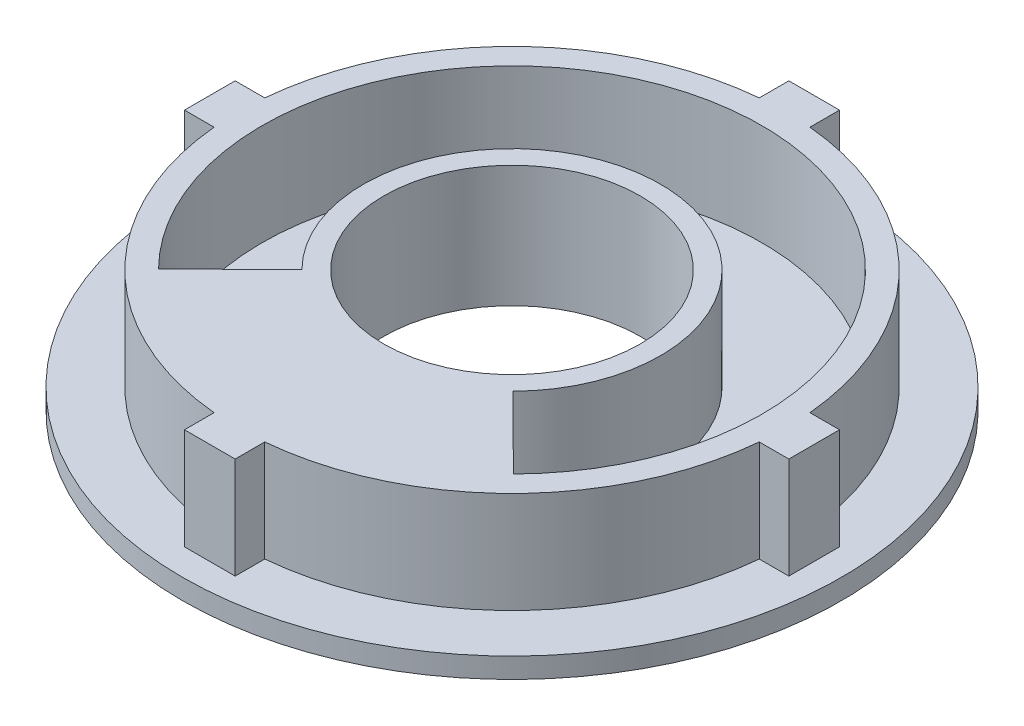
ISO-10303-21;
HEADER;
FILE_DESCRIPTION(('STEP AP214'),'2;1');
FILE_NAME('part.step','',(''),(''),'','','');
FILE_SCHEMA(('AUTOMOTIVE_DESIGN { 1 0 10303 214 1 1 1 1 }'));
ENDSEC;
DATA;
#1=APPLICATION_CONTEXT('core data for automotive mechanical design processes');
#2=APPLICATION_PROTOCOL_DEFINITION('international standard','automotive_design',2000,#1);
#3=PRODUCT_CONTEXT('',#1,'mechanical');
#4=PRODUCT('Part','Part','',(#3));
#5=PRODUCT_RELATED_PRODUCT_CATEGORY('part','',(#4));
#6=PRODUCT_DEFINITION_FORMATION('','',#4);
#7=PRODUCT_DEFINITION_CONTEXT('part definition',#1,'design');
#8=PRODUCT_DEFINITION('design','',#6,#7);
#9=PRODUCT_DEFINITION_SHAPE('','',#8);
#10=(LENGTH_UNIT() NAMED_UNIT(*) SI_UNIT(.MILLI.,.METRE.));
#11=(NAMED_UNIT(*) PLANE_ANGLE_UNIT() SI_UNIT($,.RADIAN.));
#12=(NAMED_UNIT(*) SI_UNIT($,.STERADIAN.) SOLID_ANGLE_UNIT());
#13=UNCERTAINTY_MEASURE_WITH_UNIT(LENGTH_MEASURE(1.E-05),#10,'distance_accuracy_value','');
#14=(GEOMETRIC_REPRESENTATION_CONTEXT(3) GLOBAL_UNCERTAINTY_ASSIGNED_CONTEXT((#13)) GLOBAL_UNIT_ASSIGNED_CONTEXT((#10,
#11,#12)) REPRESENTATION_CONTEXT('',''));
#15=CARTESIAN_POINT('',(0.,0.,0.));
#16=DIRECTION('',(0.,0.,1.));
#17=DIRECTION('',(1.,0.,0.));
#18=AXIS2_PLACEMENT_3D('',#15,#16,#17);
#19=CARTESIAN_POINT('',(0.,10.,0.));
#20=DIRECTION('',(0.,-1.,0.));
#21=DIRECTION('',(0.,0.,-1.));
#22=AXIS2_PLACEMENT_3D('',#19,#20,#21);
#23=CYLINDRICAL_SURFACE('',#22,27.);
#24=DIRECTION('',(0.,-1.,0.));
#25=VECTOR('',#24,1.);
#26=CARTESIAN_POINT('',(-26.8840101175404,10.,-2.49999999999735));
#27=LINE('',#26,#25);
#28=CARTESIAN_POINT('',(-26.8840101175404,10.,-2.49999999999735));
#29=VERTEX_POINT('',#28);
#30=CARTESIAN_POINT('',(-26.8840101175404,0.,-2.49999999999735));
#31=VERTEX_POINT('',#30);
#32=EDGE_CURVE('E204',#29,#31,#27,.T.);
#33=ORIENTED_EDGE('',*,*,#32,.F.);
#34=CARTESIAN_POINT('',(0.,10.,0.));
#35=DIRECTION('',(0.,1.,0.));
#36=DIRECTION('',(0.,0.,1.));
#37=AXIS2_PLACEMENT_3D('',#34,#35,#36);
#38=CIRCLE('',#37,27.);
#39=CARTESIAN_POINT('',(-2.5,10.,-26.8840101175401));
#40=VERTEX_POINT('',#39);
#41=EDGE_CURVE('E44',#40,#29,#38,.T.);
#42=ORIENTED_EDGE('',*,*,#41,.F.);
#43=DIRECTION('',(0.,-1.,0.));
#44=VECTOR('',#43,1.);
#45=CARTESIAN_POINT('',(-2.5,10.,-26.8840101175401));
#46=LINE('',#45,#44);
#47=CARTESIAN_POINT('',(-2.5,0.,-26.8840101175401));
#48=VERTEX_POINT('',#47);
#49=EDGE_CURVE('E280',#48,#40,#46,.F.);
#50=ORIENTED_EDGE('',*,*,#49,.F.);
#51=CARTESIAN_POINT('',(0.,0.,0.));
#52=DIRECTION('',(0.,1.,0.));
#53=DIRECTION('',(0.,0.,1.));
#54=AXIS2_PLACEMENT_3D('',#51,#52,#53);
#55=CIRCLE('',#54,27.);
#56=EDGE_CURVE('E311',#48,#31,#55,.T.);
#57=ORIENTED_EDGE('',*,*,#56,.T.);
#58=EDGE_LOOP('',(#33,#42,#50,#57));
#59=FACE_BOUND('',#58,.T.);
#60=ADVANCED_FACE('F37',(#59),#23,.T.);
#61=DIRECTION('',(0.,-1.,0.));
#62=VECTOR('',#61,1.);
#63=CARTESIAN_POINT('',(-26.8840101175399,10.,2.50000000000265));
#64=LINE('',#63,#62);
#65=CARTESIAN_POINT('',(-26.8840101175399,0.,2.50000000000265));
#66=VERTEX_POINT('',#65);
#67=CARTESIAN_POINT('',(-26.8840101175399,10.,2.50000000000265));
#68=VERTEX_POINT('',#67);
#69=EDGE_CURVE('E188',#66,#68,#64,.F.);
#70=ORIENTED_EDGE('',*,*,#69,.F.);
#71=CARTESIAN_POINT('',(-2.49999999999417,0.,26.8840101175407));
#72=VERTEX_POINT('',#71);
#73=EDGE_CURVE('E333',#66,#72,#55,.T.);
#74=ORIENTED_EDGE('',*,*,#73,.T.);
#75=DIRECTION('',(0.,-1.,0.));
#76=VECTOR('',#75,1.);
#77=CARTESIAN_POINT('',(-2.49999999999417,10.,26.8840101175407));
#78=LINE('',#77,#76);
#79=CARTESIAN_POINT('',(-2.49999999999417,10.,26.8840101175407));
#80=VERTEX_POINT('',#79);
#81=EDGE_CURVE('E231',#80,#72,#78,.T.);
#82=ORIENTED_EDGE('',*,*,#81,.F.);
#83=EDGE_CURVE('E331',#68,#80,#38,.T.);
#84=ORIENTED_EDGE('',*,*,#83,.F.);
#85=EDGE_LOOP('',(#70,#74,#82,#84));
#86=FACE_BOUND('',#85,.T.);
#87=ADVANCED_FACE('F369',(#86),#23,.T.);
#88=CARTESIAN_POINT('',(0.,0.,0.));
#89=DIRECTION('',(0.,-1.,0.));
#90=DIRECTION('',(0.,0.,-1.));
#91=AXIS2_PLACEMENT_3D('',#88,#89,#90);
#92=PLANE('',#91);
#93=CARTESIAN_POINT('',(0.,0.,0.));
#94=DIRECTION('',(0.,-1.,0.));
#95=DIRECTION('',(0.,0.,-1.));
#96=AXIS2_PLACEMENT_3D('',#93,#94,#95);
#97=CIRCLE('',#96,32.5);
#98=CARTESIAN_POINT('',(0.,0.,-32.5));
#99=VERTEX_POINT('',#98);
#100=EDGE_CURVE('E289',#99,#99,#97,.T.);
#101=ORIENTED_EDGE('',*,*,#100,.F.);
#102=EDGE_LOOP('',(#101));
#103=FACE_BOUND('',#102,.T.);
#104=DIRECTION('',(-1.,0.,0.));
#105=VECTOR('',#104,1.);
#106=CARTESIAN_POINT('',(-29.7999999999968,0.,-2.49999999999735));
#107=LINE('',#106,#105);
#108=CARTESIAN_POINT('',(-29.7999999999968,0.,-2.49999999999735));
#109=VERTEX_POINT('',#108);
#110=EDGE_CURVE('E186',#31,#109,#107,.T.);
#111=ORIENTED_EDGE('',*,*,#110,.F.);
#112=ORIENTED_EDGE('',*,*,#56,.F.);
#113=DIRECTION('',(0.,0.,1.));
#114=VECTOR('',#113,1.);
#115=CARTESIAN_POINT('',(-2.5,0.,-29.8));
#116=LINE('',#115,#114);
#117=CARTESIAN_POINT('',(-2.5,0.,-29.8));
#118=VERTEX_POINT('',#117);
#119=EDGE_CURVE('E266',#118,#48,#116,.T.);
#120=ORIENTED_EDGE('',*,*,#119,.F.);
#121=DIRECTION('',(-1.,0.,0.));
#122=VECTOR('',#121,1.);
#123=CARTESIAN_POINT('',(-2.5,0.,-29.8));
#124=LINE('',#123,#122);
#125=CARTESIAN_POINT('',(2.5,0.,-29.8));
#126=VERTEX_POINT('',#125);
#127=EDGE_CURVE('E262',#126,#118,#124,.T.);
#128=ORIENTED_EDGE('',*,*,#127,.F.);
#129=DIRECTION('',(0.,0.,-1.));
#130=VECTOR('',#129,1.);
#131=CARTESIAN_POINT('',(2.5,0.,0.));
#132=LINE('',#131,#130);
#133=CARTESIAN_POINT('',(2.5,0.,-26.8840101175401));
#134=VERTEX_POINT('',#133);
#135=EDGE_CURVE('E11',#134,#126,#132,.T.);
#136=ORIENTED_EDGE('',*,*,#135,.F.);
#137=CARTESIAN_POINT('',(26.8840101175398,0.,-2.50000000000318));
#138=VERTEX_POINT('',#137);
#139=EDGE_CURVE('E293',#138,#134,#55,.T.);
#140=ORIENTED_EDGE('',*,*,#139,.F.);
#141=DIRECTION('',(-1.,0.,0.));
#142=VECTOR('',#141,1.);
#143=CARTESIAN_POINT('',(29.8000000000026,0.,-2.50000000000318));
#144=LINE('',#143,#142);
#145=CARTESIAN_POINT('',(29.8000000000026,0.,-2.50000000000318));
#146=VERTEX_POINT('',#145);
#147=EDGE_CURVE('E238',#146,#138,#144,.T.);
#148=ORIENTED_EDGE('',*,*,#147,.F.);
#149=DIRECTION('',(0.,0.,-1.));
#150=VECTOR('',#149,1.);
#151=CARTESIAN_POINT('',(29.8000000000026,0.,-2.50000000000318));
#152=LINE('',#151,#150);
#153=CARTESIAN_POINT('',(29.8000000000026,0.,2.49999999999682));
#154=VERTEX_POINT('',#153);
#155=EDGE_CURVE('E246',#154,#146,#152,.T.);
#156=ORIENTED_EDGE('',*,*,#155,.F.);
#157=DIRECTION('',(1.,0.,0.));
#158=VECTOR('',#157,1.);
#159=CARTESIAN_POINT('',(29.8000000000026,0.,2.49999999999682));
#160=LINE('',#159,#158);
#161=CARTESIAN_POINT('',(26.8840101175404,0.,2.49999999999682));
#162=VERTEX_POINT('',#161);
#163=EDGE_CURVE('E234',#162,#154,#160,.T.);
#164=ORIENTED_EDGE('',*,*,#163,.F.);
#165=CARTESIAN_POINT('',(2.50000000000583,0.,26.8840101175396));
#166=VERTEX_POINT('',#165);
#167=EDGE_CURVE('E336',#166,#162,#55,.T.);
#168=ORIENTED_EDGE('',*,*,#167,.F.);
#169=DIRECTION('',(0.,0.,-1.));
#170=VECTOR('',#169,1.);
#171=CARTESIAN_POINT('',(2.50000000000583,0.,29.7999999999995));
#172=LINE('',#171,#170);
#173=CARTESIAN_POINT('',(2.50000000000583,0.,29.7999999999995));
#174=VERTEX_POINT('',#173);
#175=EDGE_CURVE('E210',#174,#166,#172,.T.);
#176=ORIENTED_EDGE('',*,*,#175,.F.);
#177=DIRECTION('',(1.,0.,0.));
#178=VECTOR('',#177,1.);
#179=CARTESIAN_POINT('',(2.50000000000583,0.,29.7999999999995));
#180=LINE('',#179,#178);
#181=CARTESIAN_POINT('',(-2.49999999999417,0.,29.7999999999995));
#182=VERTEX_POINT('',#181);
#183=EDGE_CURVE('E218',#182,#174,#180,.T.);
#184=ORIENTED_EDGE('',*,*,#183,.F.);
#185=DIRECTION('',(0.,0.,1.));
#186=VECTOR('',#185,1.);
#187=CARTESIAN_POINT('',(-2.49999999999417,0.,29.7999999999995));
#188=LINE('',#187,#186);
#189=EDGE_CURVE('E206',#72,#182,#188,.T.);
#190=ORIENTED_EDGE('',*,*,#189,.F.);
#191=ORIENTED_EDGE('',*,*,#73,.F.);
#192=DIRECTION('',(1.,0.,0.));
#193=VECTOR('',#192,1.);
#194=CARTESIAN_POINT('',(-29.7999999999968,0.,2.50000000000265));
#195=LINE('',#194,#193);
#196=CARTESIAN_POINT('',(-29.7999999999968,0.,2.50000000000265));
#197=VERTEX_POINT('',#196);
#198=EDGE_CURVE('E56',#197,#66,#195,.T.);
#199=ORIENTED_EDGE('',*,*,#198,.F.);
#200=DIRECTION('',(0.,0.,1.));
#201=VECTOR('',#200,1.);
#202=CARTESIAN_POINT('',(-29.7999999999968,0.,2.50000000000265));
#203=LINE('',#202,#201);
#204=EDGE_CURVE('E51',#109,#197,#203,.T.);
#205=ORIENTED_EDGE('',*,*,#204,.F.);
#206=EDGE_LOOP('',(#111,#112,#120,#128,#136,#140,#148,#156,#164,#168,#176,#184,#190,#191,#199,#205));
#207=FACE_BOUND('',#206,.T.);
#208=ADVANCED_FACE('F347',(#103,#207),#92,.F.);
#209=DIRECTION('',(0.,-1.,0.));
#210=VECTOR('',#209,1.);
#211=CARTESIAN_POINT('',(2.50000000000583,10.,26.8840101175396));
#212=LINE('',#211,#210);
#213=CARTESIAN_POINT('',(2.50000000000583,10.,26.8840101175396));
#214=VERTEX_POINT('',#213);
#215=EDGE_CURVE('E228',#166,#214,#212,.F.);
#216=ORIENTED_EDGE('',*,*,#215,.F.);
#217=ORIENTED_EDGE('',*,*,#167,.T.);
#218=DIRECTION('',(0.,-1.,0.));
#219=VECTOR('',#218,1.);
#220=CARTESIAN_POINT('',(26.8840101175404,10.,2.49999999999682));
#221=LINE('',#220,#219);
#222=CARTESIAN_POINT('',(26.8840101175404,10.,2.49999999999682));
#223=VERTEX_POINT('',#222);
#224=EDGE_CURVE('E259',#223,#162,#221,.T.);
#225=ORIENTED_EDGE('',*,*,#224,.F.);
#226=EDGE_CURVE('E353',#214,#223,#38,.T.);
#227=ORIENTED_EDGE('',*,*,#226,.F.);
#228=EDGE_LOOP('',(#216,#217,#225,#227));
#229=FACE_BOUND('',#228,.T.);
#230=ADVANCED_FACE('F345',(#229),#23,.T.);
#231=DIRECTION('',(0.,-1.,0.));
#232=VECTOR('',#231,1.);
#233=CARTESIAN_POINT('',(26.8840101175398,10.,-2.50000000000318));
#234=LINE('',#233,#232);
#235=CARTESIAN_POINT('',(26.8840101175398,10.,-2.50000000000318));
#236=VERTEX_POINT('',#235);
#237=EDGE_CURVE('E256',#138,#236,#234,.F.);
#238=ORIENTED_EDGE('',*,*,#237,.F.);
#239=ORIENTED_EDGE('',*,*,#139,.T.);
#240=DIRECTION('',(0.,-1.,0.));
#241=VECTOR('',#240,1.);
#242=CARTESIAN_POINT('',(2.5,10.,-26.8840101175401));
#243=LINE('',#242,#241);
#244=CARTESIAN_POINT('',(2.5,10.,-26.8840101175401));
#245=VERTEX_POINT('',#244);
#246=EDGE_CURVE('E283',#245,#134,#243,.T.);
#247=ORIENTED_EDGE('',*,*,#246,.F.);
#248=EDGE_CURVE('E330',#236,#245,#38,.T.);
#249=ORIENTED_EDGE('',*,*,#248,.F.);
#250=EDGE_LOOP('',(#238,#239,#247,#249));
#251=FACE_BOUND('',#250,.T.);
#252=ADVANCED_FACE('F358',(#251),#23,.T.);
#253=CARTESIAN_POINT('',(0.,10.,0.));
#254=DIRECTION('',(0.,1.,0.));
#255=DIRECTION('',(0.,0.,1.));
#256=AXIS2_PLACEMENT_3D('',#253,#254,#255);
#257=PLANE('',#256);
#258=ORIENTED_EDGE('',*,*,#41,.T.);
#259=DIRECTION('',(-1.,0.,0.));
#260=VECTOR('',#259,1.);
#261=CARTESIAN_POINT('',(-29.7999999999968,10.,-2.49999999999735));
#262=LINE('',#261,#260);
#263=CARTESIAN_POINT('',(-29.7999999999968,10.,-2.49999999999735));
#264=VERTEX_POINT('',#263);
#265=EDGE_CURVE('E171',#29,#264,#262,.T.);
#266=ORIENTED_EDGE('',*,*,#265,.T.);
#267=DIRECTION('',(0.,0.,1.));
#268=VECTOR('',#267,1.);
#269=CARTESIAN_POINT('',(-29.7999999999968,10.,2.50000000000265));
#270=LINE('',#269,#268);
#271=CARTESIAN_POINT('',(-29.7999999999968,10.,2.50000000000265));
#272=VERTEX_POINT('',#271);
#273=EDGE_CURVE('E177',#264,#272,#270,.T.);
#274=ORIENTED_EDGE('',*,*,#273,.T.);
#275=DIRECTION('',(1.,0.,0.));
#276=VECTOR('',#275,1.);
#277=CARTESIAN_POINT('',(-29.7999999999968,10.,2.50000000000265));
#278=LINE('',#277,#276);
#279=EDGE_CURVE('E194',#272,#68,#278,.T.);
#280=ORIENTED_EDGE('',*,*,#279,.T.);
#281=ORIENTED_EDGE('',*,*,#83,.T.);
#282=DIRECTION('',(0.,0.,1.));
#283=VECTOR('',#282,1.);
#284=CARTESIAN_POINT('',(-2.49999999999417,10.,29.7999999999995));
#285=LINE('',#284,#283);
#286=CARTESIAN_POINT('',(-2.49999999999417,10.,29.7999999999995));
#287=VERTEX_POINT('',#286);
#288=EDGE_CURVE('E207',#80,#287,#285,.T.);
#289=ORIENTED_EDGE('',*,*,#288,.T.);
#290=DIRECTION('',(1.,0.,0.));
#291=VECTOR('',#290,1.);
#292=CARTESIAN_POINT('',(2.50000000000583,10.,29.7999999999995));
#293=LINE('',#292,#291);
#294=CARTESIAN_POINT('',(2.50000000000583,10.,29.7999999999995));
#295=VERTEX_POINT('',#294);
#296=EDGE_CURVE('E209',#287,#295,#293,.T.);
#297=ORIENTED_EDGE('',*,*,#296,.T.);
#298=DIRECTION('',(0.,0.,-1.));
#299=VECTOR('',#298,1.);
#300=CARTESIAN_POINT('',(2.50000000000583,10.,29.7999999999995));
#301=LINE('',#300,#299);
#302=EDGE_CURVE('E212',#295,#214,#301,.T.);
#303=ORIENTED_EDGE('',*,*,#302,.T.);
#304=ORIENTED_EDGE('',*,*,#226,.T.);
#305=DIRECTION('',(1.,0.,0.));
#306=VECTOR('',#305,1.);
#307=CARTESIAN_POINT('',(29.8000000000026,10.,2.49999999999682));
#308=LINE('',#307,#306);
#309=CARTESIAN_POINT('',(29.8000000000026,10.,2.49999999999682));
#310=VERTEX_POINT('',#309);
#311=EDGE_CURVE('E235',#223,#310,#308,.T.);
#312=ORIENTED_EDGE('',*,*,#311,.T.);
#313=DIRECTION('',(0.,0.,-1.));
#314=VECTOR('',#313,1.);
#315=CARTESIAN_POINT('',(29.8000000000026,10.,-2.50000000000318));
#316=LINE('',#315,#314);
#317=CARTESIAN_POINT('',(29.8000000000026,10.,-2.50000000000318));
#318=VERTEX_POINT('',#317);
#319=EDGE_CURVE('E237',#310,#318,#316,.T.);
#320=ORIENTED_EDGE('',*,*,#319,.T.);
#321=DIRECTION('',(-1.,0.,0.));
#322=VECTOR('',#321,1.);
#323=CARTESIAN_POINT('',(29.8000000000026,10.,-2.50000000000318));
#324=LINE('',#323,#322);
#325=EDGE_CURVE('E240',#318,#236,#324,.T.);
#326=ORIENTED_EDGE('',*,*,#325,.T.);
#327=ORIENTED_EDGE('',*,*,#248,.T.);
#328=DIRECTION('',(0.,0.,-1.));
#329=VECTOR('',#328,1.);
#330=CARTESIAN_POINT('',(2.5,10.,-29.8));
#331=LINE('',#330,#329);
#332=CARTESIAN_POINT('',(2.5,10.,-29.8));
#333=VERTEX_POINT('',#332);
#334=EDGE_CURVE('E263',#245,#333,#331,.T.);
#335=ORIENTED_EDGE('',*,*,#334,.T.);
#336=DIRECTION('',(-1.,0.,0.));
#337=VECTOR('',#336,1.);
#338=CARTESIAN_POINT('',(-2.5,10.,-29.8));
#339=LINE('',#338,#337);
#340=CARTESIAN_POINT('',(-2.5,10.,-29.8));
#341=VERTEX_POINT('',#340);
#342=EDGE_CURVE('E265',#333,#341,#339,.T.);
#343=ORIENTED_EDGE('',*,*,#342,.T.);
#344=DIRECTION('',(0.,0.,1.));
#345=VECTOR('',#344,1.);
#346=CARTESIAN_POINT('',(-2.5,10.,-29.8));
#347=LINE('',#346,#345);
#348=EDGE_CURVE('E268',#341,#40,#347,.T.);
#349=ORIENTED_EDGE('',*,*,#348,.T.);
#350=EDGE_LOOP('',(#258,#266,#274,#280,#281,#289,#297,#303,#304,#312,#320,#326,#327,#335,#343,#349));
#351=FACE_BOUND('',#350,.T.);
#352=CARTESIAN_POINT('',(0.,10.,0.));
#353=DIRECTION('',(0.,1.,0.));
#354=DIRECTION('',(0.,0.,1.));
#355=AXIS2_PLACEMENT_3D('',#352,#353,#354);
#356=CIRCLE('',#355,12.65);
#357=CARTESIAN_POINT('',(0.,10.,12.65));
#358=VERTEX_POINT('',#357);
#359=EDGE_CURVE('E327',#358,#358,#356,.T.);
#360=ORIENTED_EDGE('',*,*,#359,.F.);
#361=EDGE_LOOP('',(#360));
#362=FACE_BOUND('',#361,.T.);
#363=DIRECTION('',(0.709939148073023,0.,-0.704263023332441));
#364=VECTOR('',#363,1.);
#365=CARTESIAN_POINT('',(-17.5,10.,17.3600835251447));
#366=LINE('',#365,#364);
#367=CARTESIAN_POINT('',(-17.5,10.,17.3600835251447));
#368=VERTEX_POINT('',#367);
#369=CARTESIAN_POINT('',(-10.4006085192698,10.,10.3174532918203));
#370=VERTEX_POINT('',#369);
#371=EDGE_CURVE('E298',#368,#370,#366,.T.);
#372=ORIENTED_EDGE('',*,*,#371,.F.);
#373=CARTESIAN_POINT('',(0.,10.,0.));
#374=DIRECTION('',(0.,1.,0.));
#375=DIRECTION('',(0.,0.,1.));
#376=AXIS2_PLACEMENT_3D('',#373,#374,#375);
#377=CIRCLE('',#376,24.65);
#378=CARTESIAN_POINT('',(17.5,10.,17.3600835251447));
#379=VERTEX_POINT('',#378);
#380=EDGE_CURVE('E296',#379,#368,#377,.T.);
#381=ORIENTED_EDGE('',*,*,#380,.F.);
#382=DIRECTION('',(0.709939148073023,0.,0.704263023332441));
#383=VECTOR('',#382,1.);
#384=CARTESIAN_POINT('',(17.5,10.,17.3600835251447));
#385=LINE('',#384,#383);
#386=CARTESIAN_POINT('',(10.4006085192698,10.,10.3174532918203));
#387=VERTEX_POINT('',#386);
#388=EDGE_CURVE('E304',#387,#379,#385,.T.);
#389=ORIENTED_EDGE('',*,*,#388,.F.);
#390=CARTESIAN_POINT('',(0.,10.,0.));
#391=DIRECTION('',(0.,-1.,0.));
#392=DIRECTION('',(0.,0.,1.));
#393=AXIS2_PLACEMENT_3D('',#390,#391,#392);
#394=CIRCLE('',#393,14.65);
#395=EDGE_CURVE('E301',#370,#387,#394,.T.);
#396=ORIENTED_EDGE('',*,*,#395,.F.);
#397=EDGE_LOOP('',(#372,#381,#389,#396));
#398=FACE_BOUND('',#397,.T.);
#399=ADVANCED_FACE('F173',(#351,#362,#398),#257,.T.);
#400=CARTESIAN_POINT('',(0.,10.,0.));
#401=DIRECTION('',(0.,-1.,0.));
#402=DIRECTION('',(0.,0.,-1.));
#403=AXIS2_PLACEMENT_3D('',#400,#401,#402);
#404=CYLINDRICAL_SURFACE('',#403,12.65);
#405=ORIENTED_EDGE('',*,*,#359,.T.);
#406=EDGE_LOOP('',(#405));
#407=FACE_BOUND('',#406,.T.);
#408=CARTESIAN_POINT('',(0.,-2.,0.));
#409=DIRECTION('',(0.,-1.,0.));
#410=DIRECTION('',(0.,0.,-1.));
#411=AXIS2_PLACEMENT_3D('',#408,#409,#410);
#412=CIRCLE('',#411,12.65);
#413=CARTESIAN_POINT('',(0.,-2.,-12.65));
#414=VERTEX_POINT('',#413);
#415=EDGE_CURVE('E286',#414,#414,#412,.T.);
#416=ORIENTED_EDGE('',*,*,#415,.T.);
#417=EDGE_LOOP('',(#416));
#418=FACE_BOUND('',#417,.T.);
#419=ADVANCED_FACE('F379',(#407,#418),#404,.F.);
#420=CARTESIAN_POINT('',(0.,10.,0.));
#421=DIRECTION('',(0.,-1.,0.));
#422=DIRECTION('',(0.,0.,-1.));
#423=AXIS2_PLACEMENT_3D('',#420,#421,#422);
#424=CYLINDRICAL_SURFACE('',#423,24.65);
#425=CARTESIAN_POINT('',(0.,0.,0.));
#426=DIRECTION('',(0.,1.,0.));
#427=DIRECTION('',(0.,0.,1.));
#428=AXIS2_PLACEMENT_3D('',#425,#426,#427);
#429=CIRCLE('',#428,24.65);
#430=CARTESIAN_POINT('',(17.5,0.,17.3600835251447));
#431=VERTEX_POINT('',#430);
#432=CARTESIAN_POINT('',(-17.5,0.,17.3600835251447));
#433=VERTEX_POINT('',#432);
#434=EDGE_CURVE('E307',#431,#433,#429,.T.);
#435=ORIENTED_EDGE('',*,*,#434,.F.);
#436=DIRECTION('',(0.,-1.,0.));
#437=VECTOR('',#436,1.);
#438=CARTESIAN_POINT('',(17.5,10.,17.3600835251447));
#439=LINE('',#438,#437);
#440=EDGE_CURVE('E306',#379,#431,#439,.T.);
#441=ORIENTED_EDGE('',*,*,#440,.F.);
#442=ORIENTED_EDGE('',*,*,#380,.T.);
#443=DIRECTION('',(0.,-1.,0.));
#444=VECTOR('',#443,1.);
#445=CARTESIAN_POINT('',(-17.5,10.,17.3600835251447));
#446=LINE('',#445,#444);
#447=EDGE_CURVE('E324',#368,#433,#446,.T.);
#448=ORIENTED_EDGE('',*,*,#447,.T.);
#449=EDGE_LOOP('',(#435,#441,#442,#448));
#450=FACE_BOUND('',#449,.T.);
#451=ADVANCED_FACE('F411',(#450),#424,.F.);
#452=CARTESIAN_POINT('',(-17.5,10.,17.3600835251447));
#453=DIRECTION('',(-0.704263023332441,0.,-0.709939148073023));
#454=DIRECTION('',(-0.709939148073023,0.,0.704263023332441));
#455=AXIS2_PLACEMENT_3D('',#452,#453,#454);
#456=PLANE('',#455);
#457=DIRECTION('',(0.709939148073023,0.,-0.704263023332441));
#458=VECTOR('',#457,1.);
#459=CARTESIAN_POINT('',(-17.5,0.,17.3600835251447));
#460=LINE('',#459,#458);
#461=CARTESIAN_POINT('',(-10.4006085192698,0.,10.3174532918203));
#462=VERTEX_POINT('',#461);
#463=EDGE_CURVE('E310',#433,#462,#460,.T.);
#464=ORIENTED_EDGE('',*,*,#463,.F.);
#465=ORIENTED_EDGE('',*,*,#447,.F.);
#466=ORIENTED_EDGE('',*,*,#371,.T.);
#467=DIRECTION('',(0.,-1.,0.));
#468=VECTOR('',#467,1.);
#469=CARTESIAN_POINT('',(-10.4006085192698,10.,10.3174532918203));
#470=LINE('',#469,#468);
#471=EDGE_CURVE('E322',#370,#462,#470,.T.);
#472=ORIENTED_EDGE('',*,*,#471,.T.);
#473=EDGE_LOOP('',(#464,#465,#466,#472));
#474=FACE_BOUND('',#473,.T.);
#475=ADVANCED_FACE('F415',(#474),#456,.T.);
#476=CARTESIAN_POINT('',(0.,10.,0.));
#477=DIRECTION('',(0.,-1.,0.));
#478=DIRECTION('',(0.,0.,-1.));
#479=AXIS2_PLACEMENT_3D('',#476,#477,#478);
#480=CYLINDRICAL_SURFACE('',#479,14.65);
#481=CARTESIAN_POINT('',(0.,0.,0.));
#482=DIRECTION('',(0.,-1.,0.));
#483=DIRECTION('',(0.,0.,1.));
#484=AXIS2_PLACEMENT_3D('',#481,#482,#483);
#485=CIRCLE('',#484,14.65);
#486=CARTESIAN_POINT('',(10.4006085192698,0.,10.3174532918203));
#487=VERTEX_POINT('',#486);
#488=EDGE_CURVE('E314',#462,#487,#485,.T.);
#489=ORIENTED_EDGE('',*,*,#488,.F.);
#490=ORIENTED_EDGE('',*,*,#471,.F.);
#491=ORIENTED_EDGE('',*,*,#395,.T.);
#492=DIRECTION('',(0.,-1.,0.));
#493=VECTOR('',#492,1.);
#494=CARTESIAN_POINT('',(10.4006085192698,10.,10.3174532918203));
#495=LINE('',#494,#493);
#496=EDGE_CURVE('E320',#387,#487,#495,.T.);
#497=ORIENTED_EDGE('',*,*,#496,.T.);
#498=EDGE_LOOP('',(#489,#490,#491,#497));
#499=FACE_BOUND('',#498,.T.);
#500=ADVANCED_FACE('F401',(#499),#480,.T.);
#501=CARTESIAN_POINT('',(17.5,10.,17.3600835251447));
#502=DIRECTION('',(0.704263023332441,0.,-0.709939148073023));
#503=DIRECTION('',(-0.709939148073023,0.,-0.704263023332441));
#504=AXIS2_PLACEMENT_3D('',#501,#502,#503);
#505=PLANE('',#504);
#506=DIRECTION('',(0.709939148073023,0.,0.704263023332441));
#507=VECTOR('',#506,1.);
#508=CARTESIAN_POINT('',(17.5,0.,17.3600835251447));
#509=LINE('',#508,#507);
#510=EDGE_CURVE('E299',#487,#431,#509,.T.);
#511=ORIENTED_EDGE('',*,*,#510,.F.);
#512=ORIENTED_EDGE('',*,*,#496,.F.);
#513=ORIENTED_EDGE('',*,*,#388,.T.);
#514=ORIENTED_EDGE('',*,*,#440,.T.);
#515=EDGE_LOOP('',(#511,#512,#513,#514));
#516=FACE_BOUND('',#515,.T.);
#517=ADVANCED_FACE('F393',(#516),#505,.T.);
#518=ORIENTED_EDGE('',*,*,#510,.T.);
#519=ORIENTED_EDGE('',*,*,#434,.T.);
#520=ORIENTED_EDGE('',*,*,#463,.T.);
#521=ORIENTED_EDGE('',*,*,#488,.T.);
#522=EDGE_LOOP('',(#518,#519,#520,#521));
#523=FACE_BOUND('',#522,.T.);
#524=ADVANCED_FACE('F385',(#523),#92,.F.);
#525=CARTESIAN_POINT('',(0.,-2.,0.));
#526=DIRECTION('',(0.,-1.,0.));
#527=DIRECTION('',(0.,0.,-1.));
#528=AXIS2_PLACEMENT_3D('',#525,#526,#527);
#529=PLANE('',#528);
#530=CARTESIAN_POINT('',(0.,-2.,0.));
#531=DIRECTION('',(0.,-1.,0.));
#532=DIRECTION('',(0.,0.,-1.));
#533=AXIS2_PLACEMENT_3D('',#530,#531,#532);
#534=CIRCLE('',#533,32.5);
#535=CARTESIAN_POINT('',(0.,-2.,-32.5));
#536=VERTEX_POINT('',#535);
#537=EDGE_CURVE('E290',#536,#536,#534,.T.);
#538=ORIENTED_EDGE('',*,*,#537,.T.);
#539=EDGE_LOOP('',(#538));
#540=FACE_BOUND('',#539,.T.);
#541=ORIENTED_EDGE('',*,*,#415,.F.);
#542=EDGE_LOOP('',(#541));
#543=FACE_BOUND('',#542,.T.);
#544=ADVANCED_FACE('F392',(#540,#543),#529,.T.);
#545=CARTESIAN_POINT('',(0.,-2.,0.));
#546=DIRECTION('',(0.,1.,0.));
#547=DIRECTION('',(0.,0.,1.));
#548=AXIS2_PLACEMENT_3D('',#545,#546,#547);
#549=CYLINDRICAL_SURFACE('',#548,32.5);
#550=ORIENTED_EDGE('',*,*,#537,.F.);
#551=EDGE_LOOP('',(#550));
#552=FACE_BOUND('',#551,.T.);
#553=ORIENTED_EDGE('',*,*,#100,.T.);
#554=EDGE_LOOP('',(#553));
#555=FACE_BOUND('',#554,.T.);
#556=ADVANCED_FACE('F399',(#552,#555),#549,.T.);
#557=CARTESIAN_POINT('',(2.5,10.,-29.8));
#558=DIRECTION('',(-1.,0.,0.));
#559=DIRECTION('',(0.,0.,1.));
#560=AXIS2_PLACEMENT_3D('',#557,#558,#559);
#561=PLANE('',#560);
#562=ORIENTED_EDGE('',*,*,#334,.F.);
#563=ORIENTED_EDGE('',*,*,#246,.T.);
#564=ORIENTED_EDGE('',*,*,#135,.T.);
#565=DIRECTION('',(0.,-1.,0.));
#566=VECTOR('',#565,1.);
#567=CARTESIAN_POINT('',(2.5,10.,-29.8));
#568=LINE('',#567,#566);
#569=EDGE_CURVE('E277',#333,#126,#568,.T.);
#570=ORIENTED_EDGE('',*,*,#569,.F.);
#571=EDGE_LOOP('',(#562,#563,#564,#570));
#572=FACE_BOUND('',#571,.T.);
#573=ADVANCED_FACE('F361',(#572),#561,.F.);
#574=CARTESIAN_POINT('',(-2.5,10.,-29.8));
#575=DIRECTION('',(1.,0.,0.));
#576=DIRECTION('',(0.,0.,-1.));
#577=AXIS2_PLACEMENT_3D('',#574,#575,#576);
#578=PLANE('',#577);
#579=ORIENTED_EDGE('',*,*,#119,.T.);
#580=ORIENTED_EDGE('',*,*,#49,.T.);
#581=ORIENTED_EDGE('',*,*,#348,.F.);
#582=DIRECTION('',(0.,-1.,0.));
#583=VECTOR('',#582,1.);
#584=CARTESIAN_POINT('',(-2.5,10.,-29.8));
#585=LINE('',#584,#583);
#586=EDGE_CURVE('E270',#341,#118,#585,.T.);
#587=ORIENTED_EDGE('',*,*,#586,.T.);
#588=EDGE_LOOP('',(#579,#580,#581,#587));
#589=FACE_BOUND('',#588,.T.);
#590=ADVANCED_FACE('F367',(#589),#578,.F.);
#591=CARTESIAN_POINT('',(-2.5,10.,-29.8));
#592=DIRECTION('',(0.,0.,1.));
#593=DIRECTION('',(1.,0.,0.));
#594=AXIS2_PLACEMENT_3D('',#591,#592,#593);
#595=PLANE('',#594);
#596=ORIENTED_EDGE('',*,*,#127,.T.);
#597=ORIENTED_EDGE('',*,*,#586,.F.);
#598=ORIENTED_EDGE('',*,*,#342,.F.);
#599=ORIENTED_EDGE('',*,*,#569,.T.);
#600=EDGE_LOOP('',(#596,#597,#598,#599));
#601=FACE_BOUND('',#600,.T.);
#602=ADVANCED_FACE('F363',(#601),#595,.F.);
#603=CARTESIAN_POINT('',(29.8000000000026,10.,2.49999999999682));
#604=DIRECTION('',(0.,0.,-1.));
#605=DIRECTION('',(-1.,0.,0.));
#606=AXIS2_PLACEMENT_3D('',#603,#604,#605);
#607=PLANE('',#606);
#608=ORIENTED_EDGE('',*,*,#311,.F.);
#609=ORIENTED_EDGE('',*,*,#224,.T.);
#610=ORIENTED_EDGE('',*,*,#163,.T.);
#611=DIRECTION('',(0.,-1.,0.));
#612=VECTOR('',#611,1.);
#613=CARTESIAN_POINT('',(29.8000000000026,10.,2.49999999999682));
#614=LINE('',#613,#612);
#615=EDGE_CURVE('E253',#310,#154,#614,.T.);
#616=ORIENTED_EDGE('',*,*,#615,.F.);
#617=EDGE_LOOP('',(#608,#609,#610,#616));
#618=FACE_BOUND('',#617,.T.);
#619=ADVANCED_FACE('F350',(#618),#607,.F.);
#620=CARTESIAN_POINT('',(29.8000000000026,10.,-2.50000000000318));
#621=DIRECTION('',(0.,0.,1.));
#622=DIRECTION('',(1.,0.,0.));
#623=AXIS2_PLACEMENT_3D('',#620,#621,#622);
#624=PLANE('',#623);
#625=ORIENTED_EDGE('',*,*,#147,.T.);
#626=ORIENTED_EDGE('',*,*,#237,.T.);
#627=ORIENTED_EDGE('',*,*,#325,.F.);
#628=DIRECTION('',(0.,-1.,0.));
#629=VECTOR('',#628,1.);
#630=CARTESIAN_POINT('',(29.8000000000026,10.,-2.50000000000318));
#631=LINE('',#630,#629);
#632=EDGE_CURVE('E243',#318,#146,#631,.T.);
#633=ORIENTED_EDGE('',*,*,#632,.T.);
#634=EDGE_LOOP('',(#625,#626,#627,#633));
#635=FACE_BOUND('',#634,.T.);
#636=ADVANCED_FACE('F536',(#635),#624,.F.);
#637=CARTESIAN_POINT('',(29.8000000000026,10.,-2.50000000000318));
#638=DIRECTION('',(-1.,0.,0.));
#639=DIRECTION('',(0.,0.,1.));
#640=AXIS2_PLACEMENT_3D('',#637,#638,#639);
#641=PLANE('',#640);
#642=ORIENTED_EDGE('',*,*,#155,.T.);
#643=ORIENTED_EDGE('',*,*,#632,.F.);
#644=ORIENTED_EDGE('',*,*,#319,.F.);
#645=ORIENTED_EDGE('',*,*,#615,.T.);
#646=EDGE_LOOP('',(#642,#643,#644,#645));
#647=FACE_BOUND('',#646,.T.);
#648=ADVANCED_FACE('F545',(#647),#641,.F.);
#649=CARTESIAN_POINT('',(-2.49999999999417,10.,29.7999999999995));
#650=DIRECTION('',(1.,0.,0.));
#651=DIRECTION('',(0.,0.,-1.));
#652=AXIS2_PLACEMENT_3D('',#649,#650,#651);
#653=PLANE('',#652);
#654=ORIENTED_EDGE('',*,*,#288,.F.);
#655=ORIENTED_EDGE('',*,*,#81,.T.);
#656=ORIENTED_EDGE('',*,*,#189,.T.);
#657=DIRECTION('',(0.,-1.,0.));
#658=VECTOR('',#657,1.);
#659=CARTESIAN_POINT('',(-2.49999999999417,10.,29.7999999999995));
#660=LINE('',#659,#658);
#661=EDGE_CURVE('E225',#287,#182,#660,.T.);
#662=ORIENTED_EDGE('',*,*,#661,.F.);
#663=EDGE_LOOP('',(#654,#655,#656,#662));
#664=FACE_BOUND('',#663,.T.);
#665=ADVANCED_FACE('F555',(#664),#653,.F.);
#666=CARTESIAN_POINT('',(2.50000000000583,10.,29.7999999999995));
#667=DIRECTION('',(-1.,0.,0.));
#668=DIRECTION('',(0.,0.,1.));
#669=AXIS2_PLACEMENT_3D('',#666,#667,#668);
#670=PLANE('',#669);
#671=ORIENTED_EDGE('',*,*,#175,.T.);
#672=ORIENTED_EDGE('',*,*,#215,.T.);
#673=ORIENTED_EDGE('',*,*,#302,.F.);
#674=DIRECTION('',(0.,-1.,0.));
#675=VECTOR('',#674,1.);
#676=CARTESIAN_POINT('',(2.50000000000583,10.,29.7999999999995));
#677=LINE('',#676,#675);
#678=EDGE_CURVE('E215',#295,#174,#677,.T.);
#679=ORIENTED_EDGE('',*,*,#678,.T.);
#680=EDGE_LOOP('',(#671,#672,#673,#679));
#681=FACE_BOUND('',#680,.T.);
#682=ADVANCED_FACE('F565',(#681),#670,.F.);
#683=CARTESIAN_POINT('',(2.50000000000583,10.,29.7999999999995));
#684=DIRECTION('',(0.,0.,-1.));
#685=DIRECTION('',(-1.,0.,0.));
#686=AXIS2_PLACEMENT_3D('',#683,#684,#685);
#687=PLANE('',#686);
#688=ORIENTED_EDGE('',*,*,#183,.T.);
#689=ORIENTED_EDGE('',*,*,#678,.F.);
#690=ORIENTED_EDGE('',*,*,#296,.F.);
#691=ORIENTED_EDGE('',*,*,#661,.T.);
#692=EDGE_LOOP('',(#688,#689,#690,#691));
#693=FACE_BOUND('',#692,.T.);
#694=ADVANCED_FACE('F575',(#693),#687,.F.);
#695=CARTESIAN_POINT('',(-29.7999999999968,10.,-2.49999999999735));
#696=DIRECTION('',(0.,0.,1.));
#697=DIRECTION('',(1.,0.,0.));
#698=AXIS2_PLACEMENT_3D('',#695,#696,#697);
#699=PLANE('',#698);
#700=ORIENTED_EDGE('',*,*,#265,.F.);
#701=ORIENTED_EDGE('',*,*,#32,.T.);
#702=ORIENTED_EDGE('',*,*,#110,.T.);
#703=DIRECTION('',(0.,-1.,0.));
#704=VECTOR('',#703,1.);
#705=CARTESIAN_POINT('',(-29.7999999999968,10.,-2.49999999999735));
#706=LINE('',#705,#704);
#707=EDGE_CURVE('E184',#264,#109,#706,.T.);
#708=ORIENTED_EDGE('',*,*,#707,.F.);
#709=EDGE_LOOP('',(#700,#701,#702,#708));
#710=FACE_BOUND('',#709,.T.);
#711=ADVANCED_FACE('F185',(#710),#699,.F.);
#712=CARTESIAN_POINT('',(-29.7999999999968,10.,2.50000000000265));
#713=DIRECTION('',(0.,0.,-1.));
#714=DIRECTION('',(-1.,0.,0.));
#715=AXIS2_PLACEMENT_3D('',#712,#713,#714);
#716=PLANE('',#715);
#717=ORIENTED_EDGE('',*,*,#198,.T.);
#718=ORIENTED_EDGE('',*,*,#69,.T.);
#719=ORIENTED_EDGE('',*,*,#279,.F.);
#720=DIRECTION('',(0.,-1.,0.));
#721=VECTOR('',#720,1.);
#722=CARTESIAN_POINT('',(-29.7999999999968,10.,2.50000000000265));
#723=LINE('',#722,#721);
#724=EDGE_CURVE('E189',#272,#197,#723,.T.);
#725=ORIENTED_EDGE('',*,*,#724,.T.);
#726=EDGE_LOOP('',(#717,#718,#719,#725));
#727=FACE_BOUND('',#726,.T.);
#728=ADVANCED_FACE('F594',(#727),#716,.F.);
#729=CARTESIAN_POINT('',(-29.7999999999968,10.,2.50000000000265));
#730=DIRECTION('',(1.,0.,0.));
#731=DIRECTION('',(0.,0.,-1.));
#732=AXIS2_PLACEMENT_3D('',#729,#730,#731);
#733=PLANE('',#732);
#734=ORIENTED_EDGE('',*,*,#204,.T.);
#735=ORIENTED_EDGE('',*,*,#724,.F.);
#736=ORIENTED_EDGE('',*,*,#273,.F.);
#737=ORIENTED_EDGE('',*,*,#707,.T.);
#738=EDGE_LOOP('',(#734,#735,#736,#737));
#739=FACE_BOUND('',#738,.T.);
#740=ADVANCED_FACE('F191',(#739),#733,.F.);
#741=CLOSED_SHELL('',(#60,#87,#208,#230,#252,#399,#419,#451,#475,#500,#517,#524,#544,#556,#573,
#590,#602,#619,#636,#648,#665,#682,#694,#711,#728,#740));
#742=MANIFOLD_SOLID_BREP('B2',#741);
#743=ADVANCED_BREP_SHAPE_REPRESENTATION('',(#18,#742),#14);
#744=SHAPE_DEFINITION_REPRESENTATION(#9,#743);
ENDSEC;
END-ISO-10303-21;
